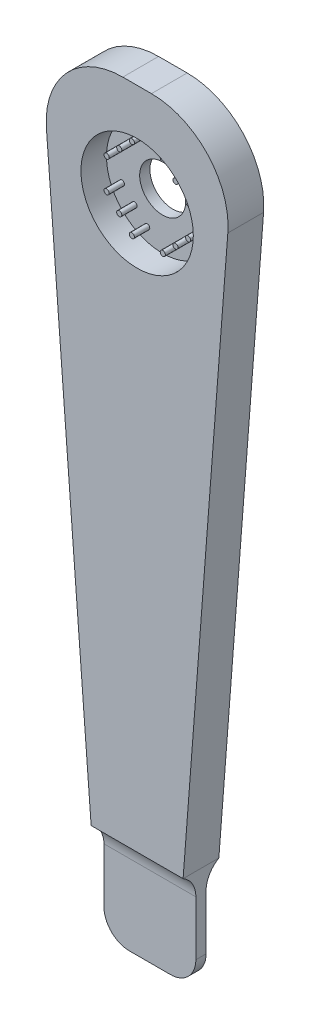
ISO-10303-21;
HEADER;
FILE_DESCRIPTION(('STEP AP214'),'2;1');
FILE_NAME('part.step','',(''),(''),'','','');
FILE_SCHEMA(('AUTOMOTIVE_DESIGN { 1 0 10303 214 1 1 1 1 }'));
ENDSEC;
DATA;
#1=APPLICATION_CONTEXT('core data for automotive mechanical design processes');
#2=APPLICATION_PROTOCOL_DEFINITION('international standard','automotive_design',2000,#1);
#3=PRODUCT_CONTEXT('',#1,'mechanical');
#4=PRODUCT('Part','Part','',(#3));
#5=PRODUCT_RELATED_PRODUCT_CATEGORY('part','',(#4));
#6=PRODUCT_DEFINITION_FORMATION('','',#4);
#7=PRODUCT_DEFINITION_CONTEXT('part definition',#1,'design');
#8=PRODUCT_DEFINITION('design','',#6,#7);
#9=PRODUCT_DEFINITION_SHAPE('','',#8);
#10=(LENGTH_UNIT() NAMED_UNIT(*) SI_UNIT(.MILLI.,.METRE.));
#11=(NAMED_UNIT(*) PLANE_ANGLE_UNIT() SI_UNIT($,.RADIAN.));
#12=(NAMED_UNIT(*) SI_UNIT($,.STERADIAN.) SOLID_ANGLE_UNIT());
#13=UNCERTAINTY_MEASURE_WITH_UNIT(LENGTH_MEASURE(1.E-05),#10,'distance_accuracy_value','');
#14=(GEOMETRIC_REPRESENTATION_CONTEXT(3) GLOBAL_UNCERTAINTY_ASSIGNED_CONTEXT((#13)) GLOBAL_UNIT_ASSIGNED_CONTEXT((#10,
#11,#12)) REPRESENTATION_CONTEXT('',''));
#15=CARTESIAN_POINT('',(0.,0.,0.));
#16=DIRECTION('',(0.,0.,1.));
#17=DIRECTION('',(1.,0.,0.));
#18=AXIS2_PLACEMENT_3D('',#15,#16,#17);
#19=CARTESIAN_POINT('',(9.,130.,7.));
#20=DIRECTION('',(0.,0.,-1.));
#21=DIRECTION('',(-1.,0.,0.));
#22=AXIS2_PLACEMENT_3D('',#19,#20,#21);
#23=CYLINDRICAL_SURFACE('',#22,4.50000000000001);
#24=CARTESIAN_POINT('',(9.,130.,0.));
#25=DIRECTION('',(0.,0.,1.));
#26=DIRECTION('',(1.,0.,0.));
#27=AXIS2_PLACEMENT_3D('',#24,#25,#26);
#28=CIRCLE('',#27,4.50000000000001);
#29=CARTESIAN_POINT('',(13.5,130.,0.));
#30=VERTEX_POINT('',#29);
#31=EDGE_CURVE('E228',#30,#30,#28,.T.);
#32=ORIENTED_EDGE('',*,*,#31,.F.);
#33=EDGE_LOOP('',(#32));
#34=FACE_BOUND('',#33,.T.);
#35=CARTESIAN_POINT('',(9.,130.,2.));
#36=DIRECTION('',(0.,0.,1.));
#37=DIRECTION('',(1.,0.,0.));
#38=AXIS2_PLACEMENT_3D('',#35,#36,#37);
#39=CIRCLE('',#38,4.50000000000001);
#40=CARTESIAN_POINT('',(13.5,130.,2.));
#41=VERTEX_POINT('',#40);
#42=EDGE_CURVE('E170',#41,#41,#39,.T.);
#43=ORIENTED_EDGE('',*,*,#42,.T.);
#44=EDGE_LOOP('',(#43));
#45=FACE_BOUND('',#44,.T.);
#46=ADVANCED_FACE('F43',(#34,#45),#23,.F.);
#47=CARTESIAN_POINT('',(16.3647058823529,-1.25882352941176,7.));
#48=DIRECTION('',(-0.997054485501582,0.076696498884737,0.));
#49=DIRECTION('',(-0.076696498884737,-0.997054485501582,0.));
#50=AXIS2_PLACEMENT_3D('',#47,#48,#49);
#51=PLANE('',#50);
#52=DIRECTION('',(0.076696498884737,0.997054485501582,0.));
#53=VECTOR('',#52,1.);
#54=CARTESIAN_POINT('',(16.3647058823529,-1.25882352941176,0.));
#55=LINE('',#54,#53);
#56=CARTESIAN_POINT('',(18.,20.,0.));
#57=VERTEX_POINT('',#56);
#58=CARTESIAN_POINT('',(26.7576578859022,133.849552516729,0.));
#59=VERTEX_POINT('',#58);
#60=EDGE_CURVE('E225',#57,#59,#55,.T.);
#61=ORIENTED_EDGE('',*,*,#60,.T.);
#62=DIRECTION('',(0.,0.,-1.));
#63=VECTOR('',#62,1.);
#64=CARTESIAN_POINT('',(26.7576578859022,133.849552516729,7.));
#65=LINE('',#64,#63);
#66=CARTESIAN_POINT('',(26.7576578859022,133.849552516729,7.));
#67=VERTEX_POINT('',#66);
#68=EDGE_CURVE('E66',#59,#67,#65,.F.);
#69=ORIENTED_EDGE('',*,*,#68,.T.);
#70=DIRECTION('',(0.076696498884737,0.997054485501582,0.));
#71=VECTOR('',#70,1.);
#72=CARTESIAN_POINT('',(16.3647058823529,-1.25882352941176,7.));
#73=LINE('',#72,#71);
#74=CARTESIAN_POINT('',(18.,20.,7.));
#75=VERTEX_POINT('',#74);
#76=EDGE_CURVE('E210',#75,#67,#73,.T.);
#77=ORIENTED_EDGE('',*,*,#76,.F.);
#78=DIRECTION('',(0.,0.,-1.));
#79=VECTOR('',#78,1.);
#80=CARTESIAN_POINT('',(18.,20.,7.));
#81=LINE('',#80,#79);
#82=EDGE_CURVE('E167',#75,#57,#81,.T.);
#83=ORIENTED_EDGE('',*,*,#82,.T.);
#84=EDGE_LOOP('',(#61,#69,#77,#83));
#85=FACE_BOUND('',#84,.T.);
#86=ADVANCED_FACE('F227',(#85),#51,.F.);
#87=CARTESIAN_POINT('',(0.,150.,7.));
#88=DIRECTION('',(0.,-1.,0.));
#89=DIRECTION('',(0.,0.,-1.));
#90=AXIS2_PLACEMENT_3D('',#87,#88,#89);
#91=PLANE('',#90);
#92=DIRECTION('',(-1.,0.,0.));
#93=VECTOR('',#92,1.);
#94=CARTESIAN_POINT('',(0.,150.,7.));
#95=LINE('',#94,#93);
#96=CARTESIAN_POINT('',(11.8018406033785,150.,7.));
#97=VERTEX_POINT('',#96);
#98=CARTESIAN_POINT('',(6.1981593966215,150.,7.));
#99=VERTEX_POINT('',#98);
#100=EDGE_CURVE('E208',#97,#99,#95,.T.);
#101=ORIENTED_EDGE('',*,*,#100,.F.);
#102=DIRECTION('',(0.,0.,-1.));
#103=VECTOR('',#102,1.);
#104=CARTESIAN_POINT('',(11.8018406033785,150.,7.));
#105=LINE('',#104,#103);
#106=CARTESIAN_POINT('',(11.8018406033785,150.,0.));
#107=VERTEX_POINT('',#106);
#108=EDGE_CURVE('E196',#97,#107,#105,.T.);
#109=ORIENTED_EDGE('',*,*,#108,.T.);
#110=DIRECTION('',(-1.,0.,0.));
#111=VECTOR('',#110,1.);
#112=CARTESIAN_POINT('',(0.,150.,0.));
#113=LINE('',#112,#111);
#114=CARTESIAN_POINT('',(6.1981593966215,150.,0.));
#115=VERTEX_POINT('',#114);
#116=EDGE_CURVE('E226',#107,#115,#113,.T.);
#117=ORIENTED_EDGE('',*,*,#116,.T.);
#118=DIRECTION('',(0.,0.,-1.));
#119=VECTOR('',#118,1.);
#120=CARTESIAN_POINT('',(6.1981593966215,150.,7.));
#121=LINE('',#120,#119);
#122=EDGE_CURVE('E194',#115,#99,#121,.F.);
#123=ORIENTED_EDGE('',*,*,#122,.T.);
#124=EDGE_LOOP('',(#101,#109,#117,#123));
#125=FACE_BOUND('',#124,.T.);
#126=ADVANCED_FACE('F214',(#125),#91,.F.);
#127=CARTESIAN_POINT('',(1.52941176470588,0.11764705882353,7.));
#128=DIRECTION('',(0.997054485501582,0.076696498884737,0.));
#129=DIRECTION('',(-0.076696498884737,0.997054485501582,0.));
#130=AXIS2_PLACEMENT_3D('',#127,#128,#129);
#131=PLANE('',#130);
#132=DIRECTION('',(0.0766964988847371,-0.997054485501582,0.));
#133=VECTOR('',#132,1.);
#134=CARTESIAN_POINT('',(1.52941176470588,0.11764705882353,7.));
#135=LINE('',#134,#133);
#136=CARTESIAN_POINT('',(-8.75765788590223,133.849552516729,7.));
#137=VERTEX_POINT('',#136);
#138=CARTESIAN_POINT('',(0.,20.,7.));
#139=VERTEX_POINT('',#138);
#140=EDGE_CURVE('E218',#137,#139,#135,.T.);
#141=ORIENTED_EDGE('',*,*,#140,.F.);
#142=DIRECTION('',(0.,0.,-1.));
#143=VECTOR('',#142,1.);
#144=CARTESIAN_POINT('',(-8.75765788590223,133.849552516729,7.));
#145=LINE('',#144,#143);
#146=CARTESIAN_POINT('',(-8.75765788590223,133.849552516729,0.));
#147=VERTEX_POINT('',#146);
#148=EDGE_CURVE('E11',#137,#147,#145,.T.);
#149=ORIENTED_EDGE('',*,*,#148,.T.);
#150=DIRECTION('',(0.0766964988847371,-0.997054485501582,0.));
#151=VECTOR('',#150,1.);
#152=CARTESIAN_POINT('',(1.52941176470588,0.11764705882353,0.));
#153=LINE('',#152,#151);
#154=CARTESIAN_POINT('',(0.,20.,0.));
#155=VERTEX_POINT('',#154);
#156=EDGE_CURVE('E230',#147,#155,#153,.T.);
#157=ORIENTED_EDGE('',*,*,#156,.T.);
#158=DIRECTION('',(0.,0.,-1.));
#159=VECTOR('',#158,1.);
#160=CARTESIAN_POINT('',(0.,20.,7.));
#161=LINE('',#160,#159);
#162=EDGE_CURVE('E163',#139,#155,#161,.T.);
#163=ORIENTED_EDGE('',*,*,#162,.F.);
#164=EDGE_LOOP('',(#141,#149,#157,#163));
#165=FACE_BOUND('',#164,.T.);
#166=ADVANCED_FACE('F374',(#165),#131,.F.);
#167=CARTESIAN_POINT('',(0.,0.,7.));
#168=DIRECTION('',(1.,0.,0.));
#169=DIRECTION('',(0.,1.,0.));
#170=AXIS2_PLACEMENT_3D('',#167,#168,#169);
#171=PLANE('',#170);
#172=DIRECTION('',(0.,1.,0.));
#173=VECTOR('',#172,1.);
#174=CARTESIAN_POINT('',(0.,0.,2.5));
#175=LINE('',#174,#173);
#176=CARTESIAN_POINT('',(0.,5.,2.5));
#177=VERTEX_POINT('',#176);
#178=CARTESIAN_POINT('',(0.,15.6698729810778,2.5));
#179=VERTEX_POINT('',#178);
#180=EDGE_CURVE('E157',#177,#179,#175,.T.);
#181=ORIENTED_EDGE('',*,*,#180,.F.);
#182=DIRECTION('',(0.,0.,-1.));
#183=VECTOR('',#182,1.);
#184=CARTESIAN_POINT('',(0.,5.,4.5));
#185=LINE('',#184,#183);
#186=CARTESIAN_POINT('',(0.,5.,4.5));
#187=VERTEX_POINT('',#186);
#188=EDGE_CURVE('E174',#177,#187,#185,.F.);
#189=ORIENTED_EDGE('',*,*,#188,.T.);
#190=DIRECTION('',(0.,-1.,0.));
#191=VECTOR('',#190,1.);
#192=CARTESIAN_POINT('',(0.,0.,4.5));
#193=LINE('',#192,#191);
#194=CARTESIAN_POINT('',(0.,15.6698729810778,4.5));
#195=VERTEX_POINT('',#194);
#196=EDGE_CURVE('E322',#195,#187,#193,.T.);
#197=ORIENTED_EDGE('',*,*,#196,.F.);
#198=CARTESIAN_POINT('',(0.,15.6698729810778,9.5));
#199=DIRECTION('',(1.,0.,0.));
#200=DIRECTION('',(0.,1.,0.));
#201=AXIS2_PLACEMENT_3D('',#198,#199,#200);
#202=CIRCLE('',#201,5.);
#203=EDGE_CURVE('E184',#195,#139,#202,.T.);
#204=ORIENTED_EDGE('',*,*,#203,.T.);
#205=ORIENTED_EDGE('',*,*,#162,.T.);
#206=CARTESIAN_POINT('',(0.,15.6698729810778,-2.5));
#207=DIRECTION('',(1.,0.,0.));
#208=DIRECTION('',(0.,1.,0.));
#209=AXIS2_PLACEMENT_3D('',#206,#207,#208);
#210=CIRCLE('',#209,5.);
#211=EDGE_CURVE('E192',#155,#179,#210,.T.);
#212=ORIENTED_EDGE('',*,*,#211,.T.);
#213=EDGE_LOOP('',(#181,#189,#197,#204,#205,#212));
#214=FACE_BOUND('',#213,.T.);
#215=ADVANCED_FACE('F350',(#214),#171,.F.);
#216=CARTESIAN_POINT('',(0.,0.,7.));
#217=DIRECTION('',(0.,-1.,0.));
#218=DIRECTION('',(1.,0.,0.));
#219=AXIS2_PLACEMENT_3D('',#216,#217,#218);
#220=PLANE('',#219);
#221=DIRECTION('',(1.,0.,0.));
#222=VECTOR('',#221,1.);
#223=CARTESIAN_POINT('',(0.,0.,4.5));
#224=LINE('',#223,#222);
#225=CARTESIAN_POINT('',(5.,0.,4.5));
#226=VERTEX_POINT('',#225);
#227=CARTESIAN_POINT('',(13.,0.,4.5));
#228=VERTEX_POINT('',#227);
#229=EDGE_CURVE('E325',#226,#228,#224,.T.);
#230=ORIENTED_EDGE('',*,*,#229,.F.);
#231=DIRECTION('',(0.,0.,-1.));
#232=VECTOR('',#231,1.);
#233=CARTESIAN_POINT('',(5.,0.,2.5));
#234=LINE('',#233,#232);
#235=CARTESIAN_POINT('',(5.,0.,2.5));
#236=VERTEX_POINT('',#235);
#237=EDGE_CURVE('E156',#226,#236,#234,.T.);
#238=ORIENTED_EDGE('',*,*,#237,.T.);
#239=DIRECTION('',(-1.,0.,0.));
#240=VECTOR('',#239,1.);
#241=CARTESIAN_POINT('',(0.,0.,2.5));
#242=LINE('',#241,#240);
#243=CARTESIAN_POINT('',(13.,0.,2.5));
#244=VERTEX_POINT('',#243);
#245=EDGE_CURVE('E138',#244,#236,#242,.T.);
#246=ORIENTED_EDGE('',*,*,#245,.F.);
#247=DIRECTION('',(0.,0.,-1.));
#248=VECTOR('',#247,1.);
#249=CARTESIAN_POINT('',(13.,0.,4.5));
#250=LINE('',#249,#248);
#251=EDGE_CURVE('E153',#244,#228,#250,.F.);
#252=ORIENTED_EDGE('',*,*,#251,.T.);
#253=EDGE_LOOP('',(#230,#238,#246,#252));
#254=FACE_BOUND('',#253,.T.);
#255=ADVANCED_FACE('F152',(#254),#220,.T.);
#256=CARTESIAN_POINT('',(18.,0.,7.));
#257=DIRECTION('',(-1.,0.,0.));
#258=DIRECTION('',(0.,0.,1.));
#259=AXIS2_PLACEMENT_3D('',#256,#257,#258);
#260=PLANE('',#259);
#261=DIRECTION('',(0.,1.,0.));
#262=VECTOR('',#261,1.);
#263=CARTESIAN_POINT('',(18.,0.,4.5));
#264=LINE('',#263,#262);
#265=CARTESIAN_POINT('',(18.,5.,4.5));
#266=VERTEX_POINT('',#265);
#267=CARTESIAN_POINT('',(18.,15.6698729810778,4.5));
#268=VERTEX_POINT('',#267);
#269=EDGE_CURVE('E316',#266,#268,#264,.T.);
#270=ORIENTED_EDGE('',*,*,#269,.F.);
#271=DIRECTION('',(0.,0.,-1.));
#272=VECTOR('',#271,1.);
#273=CARTESIAN_POINT('',(18.,5.,2.5));
#274=LINE('',#273,#272);
#275=CARTESIAN_POINT('',(18.,5.,2.5));
#276=VERTEX_POINT('',#275);
#277=EDGE_CURVE('E182',#266,#276,#274,.T.);
#278=ORIENTED_EDGE('',*,*,#277,.T.);
#279=DIRECTION('',(0.,-1.,0.));
#280=VECTOR('',#279,1.);
#281=CARTESIAN_POINT('',(18.,0.,2.5));
#282=LINE('',#281,#280);
#283=CARTESIAN_POINT('',(18.,15.6698729810778,2.5));
#284=VERTEX_POINT('',#283);
#285=EDGE_CURVE('E141',#284,#276,#282,.T.);
#286=ORIENTED_EDGE('',*,*,#285,.F.);
#287=CARTESIAN_POINT('',(18.,15.6698729810778,-2.5));
#288=DIRECTION('',(-1.,0.,0.));
#289=DIRECTION('',(0.,0.,1.));
#290=AXIS2_PLACEMENT_3D('',#287,#288,#289);
#291=CIRCLE('',#290,5.);
#292=EDGE_CURVE('E189',#284,#57,#291,.T.);
#293=ORIENTED_EDGE('',*,*,#292,.T.);
#294=ORIENTED_EDGE('',*,*,#82,.F.);
#295=CARTESIAN_POINT('',(18.,15.6698729810778,9.5));
#296=DIRECTION('',(-1.,0.,0.));
#297=DIRECTION('',(0.,0.,1.));
#298=AXIS2_PLACEMENT_3D('',#295,#296,#297);
#299=CIRCLE('',#298,5.);
#300=EDGE_CURVE('E187',#75,#268,#299,.T.);
#301=ORIENTED_EDGE('',*,*,#300,.T.);
#302=EDGE_LOOP('',(#270,#278,#286,#293,#294,#301));
#303=FACE_BOUND('',#302,.T.);
#304=ADVANCED_FACE('F342',(#303),#260,.F.);
#305=CARTESIAN_POINT('',(0.,0.,7.));
#306=DIRECTION('',(0.,0.,1.));
#307=DIRECTION('',(1.,0.,0.));
#308=AXIS2_PLACEMENT_3D('',#305,#306,#307);
#309=PLANE('',#308);
#310=ORIENTED_EDGE('',*,*,#76,.T.);
#311=CARTESIAN_POINT('',(11.8018406033785,135.,7.));
#312=DIRECTION('',(0.,0.,1.));
#313=DIRECTION('',(1.,0.,0.));
#314=AXIS2_PLACEMENT_3D('',#311,#312,#313);
#315=CIRCLE('',#314,15.);
#316=EDGE_CURVE('E51',#67,#97,#315,.T.);
#317=ORIENTED_EDGE('',*,*,#316,.T.);
#318=ORIENTED_EDGE('',*,*,#100,.T.);
#319=CARTESIAN_POINT('',(6.1981593966215,135.,7.));
#320=DIRECTION('',(0.,0.,1.));
#321=DIRECTION('',(1.,0.,0.));
#322=AXIS2_PLACEMENT_3D('',#319,#320,#321);
#323=CIRCLE('',#322,15.);
#324=EDGE_CURVE('E58',#99,#137,#323,.T.);
#325=ORIENTED_EDGE('',*,*,#324,.T.);
#326=ORIENTED_EDGE('',*,*,#140,.T.);
#327=DIRECTION('',(-1.,0.,0.));
#328=VECTOR('',#327,1.);
#329=CARTESIAN_POINT('',(0.,20.,7.));
#330=LINE('',#329,#328);
#331=EDGE_CURVE('E319',#75,#139,#330,.T.);
#332=ORIENTED_EDGE('',*,*,#331,.F.);
#333=EDGE_LOOP('',(#310,#317,#318,#325,#326,#332));
#334=FACE_BOUND('',#333,.T.);
#335=CARTESIAN_POINT('',(9.,130.,7.));
#336=DIRECTION('',(0.,0.,1.));
#337=DIRECTION('',(1.,0.,0.));
#338=AXIS2_PLACEMENT_3D('',#335,#336,#337);
#339=CIRCLE('',#338,11.);
#340=CARTESIAN_POINT('',(20.,130.,7.));
#341=VERTEX_POINT('',#340);
#342=EDGE_CURVE('E240',#341,#341,#339,.T.);
#343=ORIENTED_EDGE('',*,*,#342,.F.);
#344=EDGE_LOOP('',(#343));
#345=FACE_BOUND('',#344,.T.);
#346=ADVANCED_FACE('F206',(#334,#345),#309,.T.);
#347=CARTESIAN_POINT('',(0.,0.,0.));
#348=DIRECTION('',(0.,0.,1.));
#349=DIRECTION('',(1.,0.,0.));
#350=AXIS2_PLACEMENT_3D('',#347,#348,#349);
#351=PLANE('',#350);
#352=ORIENTED_EDGE('',*,*,#31,.T.);
#353=EDGE_LOOP('',(#352));
#354=FACE_BOUND('',#353,.T.);
#355=ORIENTED_EDGE('',*,*,#116,.F.);
#356=CARTESIAN_POINT('',(11.8018406033785,135.,0.));
#357=DIRECTION('',(0.,0.,1.));
#358=DIRECTION('',(1.,0.,0.));
#359=AXIS2_PLACEMENT_3D('',#356,#357,#358);
#360=CIRCLE('',#359,15.);
#361=EDGE_CURVE('E201',#107,#59,#360,.F.);
#362=ORIENTED_EDGE('',*,*,#361,.T.);
#363=ORIENTED_EDGE('',*,*,#60,.F.);
#364=DIRECTION('',(1.,0.,0.));
#365=VECTOR('',#364,1.);
#366=CARTESIAN_POINT('',(0.,20.,0.));
#367=LINE('',#366,#365);
#368=EDGE_CURVE('E158',#155,#57,#367,.T.);
#369=ORIENTED_EDGE('',*,*,#368,.F.);
#370=ORIENTED_EDGE('',*,*,#156,.F.);
#371=CARTESIAN_POINT('',(6.1981593966215,135.,0.));
#372=DIRECTION('',(0.,0.,1.));
#373=DIRECTION('',(1.,0.,0.));
#374=AXIS2_PLACEMENT_3D('',#371,#372,#373);
#375=CIRCLE('',#374,15.);
#376=EDGE_CURVE('E199',#147,#115,#375,.F.);
#377=ORIENTED_EDGE('',*,*,#376,.T.);
#378=EDGE_LOOP('',(#355,#362,#363,#369,#370,#377));
#379=FACE_BOUND('',#378,.T.);
#380=ADVANCED_FACE('F223',(#354,#379),#351,.F.);
#381=CARTESIAN_POINT('',(9.,130.,2.));
#382=DIRECTION('',(0.,0.,1.));
#383=DIRECTION('',(1.,0.,0.));
#384=AXIS2_PLACEMENT_3D('',#381,#382,#383);
#385=CYLINDRICAL_SURFACE('',#384,11.);
#386=CARTESIAN_POINT('',(9.,130.,2.));
#387=DIRECTION('',(0.,0.,1.));
#388=DIRECTION('',(1.,0.,0.));
#389=AXIS2_PLACEMENT_3D('',#386,#387,#388);
#390=CIRCLE('',#389,11.);
#391=CARTESIAN_POINT('',(20.,130.,2.));
#392=VERTEX_POINT('',#391);
#393=EDGE_CURVE('E243',#392,#392,#390,.T.);
#394=ORIENTED_EDGE('',*,*,#393,.F.);
#395=EDGE_LOOP('',(#394));
#396=FACE_BOUND('',#395,.T.);
#397=ORIENTED_EDGE('',*,*,#342,.T.);
#398=EDGE_LOOP('',(#397));
#399=FACE_BOUND('',#398,.T.);
#400=ADVANCED_FACE('F386',(#396,#399),#385,.F.);
#401=CARTESIAN_POINT('',(9.,130.,2.));
#402=DIRECTION('',(0.,0.,1.));
#403=DIRECTION('',(1.,0.,0.));
#404=AXIS2_PLACEMENT_3D('',#401,#402,#403);
#405=PLANE('',#404);
#406=CARTESIAN_POINT('',(12.0251262658471,137.974873734153,2.));
#407=DIRECTION('',(0.,0.,1.));
#408=DIRECTION('',(1.,0.,0.));
#409=AXIS2_PLACEMENT_3D('',#406,#407,#408);
#410=CIRCLE('',#409,0.500000000000001);
#411=CARTESIAN_POINT('',(12.5251262658471,137.974873734153,2.));
#412=VERTEX_POINT('',#411);
#413=EDGE_CURVE('E310',#412,#412,#410,.T.);
#414=ORIENTED_EDGE('',*,*,#413,.F.);
#415=EDGE_LOOP('',(#414));
#416=FACE_BOUND('',#415,.T.);
#417=CARTESIAN_POINT('',(14.5,135.5,2.));
#418=DIRECTION('',(0.,0.,1.));
#419=DIRECTION('',(1.,0.,0.));
#420=AXIS2_PLACEMENT_3D('',#417,#418,#419);
#421=CIRCLE('',#420,0.500000000000001);
#422=CARTESIAN_POINT('',(15.,135.5,2.));
#423=VERTEX_POINT('',#422);
#424=EDGE_CURVE('E304',#423,#423,#421,.T.);
#425=ORIENTED_EDGE('',*,*,#424,.F.);
#426=EDGE_LOOP('',(#425));
#427=FACE_BOUND('',#426,.T.);
#428=CARTESIAN_POINT('',(16.9748737341529,133.025126265847,2.));
#429=DIRECTION('',(0.,0.,1.));
#430=DIRECTION('',(1.,0.,0.));
#431=AXIS2_PLACEMENT_3D('',#428,#429,#430);
#432=CIRCLE('',#431,0.499999999999999);
#433=CARTESIAN_POINT('',(17.4748737341529,133.025126265847,2.));
#434=VERTEX_POINT('',#433);
#435=EDGE_CURVE('E298',#434,#434,#432,.T.);
#436=ORIENTED_EDGE('',*,*,#435,.F.);
#437=EDGE_LOOP('',(#436));
#438=FACE_BOUND('',#437,.T.);
#439=CARTESIAN_POINT('',(16.9748737341529,126.974873734153,2.));
#440=DIRECTION('',(0.,0.,1.));
#441=DIRECTION('',(1.,0.,0.));
#442=AXIS2_PLACEMENT_3D('',#439,#440,#441);
#443=CIRCLE('',#442,0.499999999999999);
#444=CARTESIAN_POINT('',(17.4748737341529,126.974873734153,2.));
#445=VERTEX_POINT('',#444);
#446=EDGE_CURVE('E292',#445,#445,#443,.T.);
#447=ORIENTED_EDGE('',*,*,#446,.F.);
#448=EDGE_LOOP('',(#447));
#449=FACE_BOUND('',#448,.T.);
#450=CARTESIAN_POINT('',(14.5,124.5,2.));
#451=DIRECTION('',(0.,0.,1.));
#452=DIRECTION('',(1.,0.,0.));
#453=AXIS2_PLACEMENT_3D('',#450,#451,#452);
#454=CIRCLE('',#453,0.500000000000001);
#455=CARTESIAN_POINT('',(15.,124.5,2.));
#456=VERTEX_POINT('',#455);
#457=EDGE_CURVE('E286',#456,#456,#454,.T.);
#458=ORIENTED_EDGE('',*,*,#457,.F.);
#459=EDGE_LOOP('',(#458));
#460=FACE_BOUND('',#459,.T.);
#461=CARTESIAN_POINT('',(12.0251262658471,122.025126265847,2.));
#462=DIRECTION('',(0.,0.,1.));
#463=DIRECTION('',(1.,0.,0.));
#464=AXIS2_PLACEMENT_3D('',#461,#462,#463);
#465=CIRCLE('',#464,0.500000000000001);
#466=CARTESIAN_POINT('',(12.5251262658471,122.025126265847,2.));
#467=VERTEX_POINT('',#466);
#468=EDGE_CURVE('E280',#467,#467,#465,.T.);
#469=ORIENTED_EDGE('',*,*,#468,.F.);
#470=EDGE_LOOP('',(#469));
#471=FACE_BOUND('',#470,.T.);
#472=CARTESIAN_POINT('',(5.9748737341529,122.025126265847,2.));
#473=DIRECTION('',(0.,0.,1.));
#474=DIRECTION('',(1.,0.,0.));
#475=AXIS2_PLACEMENT_3D('',#472,#473,#474);
#476=CIRCLE('',#475,0.500000000000001);
#477=CARTESIAN_POINT('',(6.4748737341529,122.025126265847,2.));
#478=VERTEX_POINT('',#477);
#479=EDGE_CURVE('E274',#478,#478,#476,.T.);
#480=ORIENTED_EDGE('',*,*,#479,.F.);
#481=EDGE_LOOP('',(#480));
#482=FACE_BOUND('',#481,.T.);
#483=CARTESIAN_POINT('',(3.5,124.5,2.));
#484=DIRECTION('',(0.,0.,1.));
#485=DIRECTION('',(1.,0.,0.));
#486=AXIS2_PLACEMENT_3D('',#483,#484,#485);
#487=CIRCLE('',#486,0.5);
#488=CARTESIAN_POINT('',(4.,124.5,2.));
#489=VERTEX_POINT('',#488);
#490=EDGE_CURVE('E268',#489,#489,#487,.T.);
#491=ORIENTED_EDGE('',*,*,#490,.F.);
#492=EDGE_LOOP('',(#491));
#493=FACE_BOUND('',#492,.T.);
#494=CARTESIAN_POINT('',(1.02512626584708,126.974873734153,2.));
#495=DIRECTION('',(0.,0.,1.));
#496=DIRECTION('',(1.,0.,0.));
#497=AXIS2_PLACEMENT_3D('',#494,#495,#496);
#498=CIRCLE('',#497,0.5);
#499=CARTESIAN_POINT('',(1.52512626584708,126.974873734153,2.));
#500=VERTEX_POINT('',#499);
#501=EDGE_CURVE('E262',#500,#500,#498,.T.);
#502=ORIENTED_EDGE('',*,*,#501,.F.);
#503=EDGE_LOOP('',(#502));
#504=FACE_BOUND('',#503,.T.);
#505=CARTESIAN_POINT('',(1.02512626584707,133.025126265847,2.));
#506=DIRECTION('',(0.,0.,1.));
#507=DIRECTION('',(1.,0.,0.));
#508=AXIS2_PLACEMENT_3D('',#505,#506,#507);
#509=CIRCLE('',#508,0.5);
#510=CARTESIAN_POINT('',(1.52512626584707,133.025126265847,2.));
#511=VERTEX_POINT('',#510);
#512=EDGE_CURVE('E256',#511,#511,#509,.T.);
#513=ORIENTED_EDGE('',*,*,#512,.F.);
#514=EDGE_LOOP('',(#513));
#515=FACE_BOUND('',#514,.T.);
#516=CARTESIAN_POINT('',(5.9748737341529,137.974873734153,2.));
#517=DIRECTION('',(0.,0.,1.));
#518=DIRECTION('',(1.,0.,0.));
#519=AXIS2_PLACEMENT_3D('',#516,#517,#518);
#520=CIRCLE('',#519,0.500000000000001);
#521=CARTESIAN_POINT('',(6.4748737341529,137.974873734153,2.));
#522=VERTEX_POINT('',#521);
#523=EDGE_CURVE('E250',#522,#522,#520,.T.);
#524=ORIENTED_EDGE('',*,*,#523,.F.);
#525=EDGE_LOOP('',(#524));
#526=FACE_BOUND('',#525,.T.);
#527=CARTESIAN_POINT('',(3.49999999999998,135.5,2.));
#528=DIRECTION('',(0.,0.,1.));
#529=DIRECTION('',(1.,0.,0.));
#530=AXIS2_PLACEMENT_3D('',#527,#528,#529);
#531=CIRCLE('',#530,0.5);
#532=CARTESIAN_POINT('',(3.99999999999998,135.5,2.));
#533=VERTEX_POINT('',#532);
#534=EDGE_CURVE('E247',#533,#533,#531,.T.);
#535=ORIENTED_EDGE('',*,*,#534,.F.);
#536=EDGE_LOOP('',(#535));
#537=FACE_BOUND('',#536,.T.);
#538=ORIENTED_EDGE('',*,*,#42,.F.);
#539=EDGE_LOOP('',(#538));
#540=FACE_BOUND('',#539,.T.);
#541=ORIENTED_EDGE('',*,*,#393,.T.);
#542=EDGE_LOOP('',(#541));
#543=FACE_BOUND('',#542,.T.);
#544=ADVANCED_FACE('F392',(#416,#427,#438,#449,#460,#471,#482,#493,#504,#515,#526,#537,#540,
#543),#405,.T.);
#545=CARTESIAN_POINT('',(3.49999999999998,135.5,5.));
#546=DIRECTION('',(0.,0.,-1.));
#547=DIRECTION('',(-1.,0.,0.));
#548=AXIS2_PLACEMENT_3D('',#545,#546,#547);
#549=CYLINDRICAL_SURFACE('',#548,0.5);
#550=CARTESIAN_POINT('',(3.49999999999998,135.5,5.));
#551=DIRECTION('',(0.,0.,1.));
#552=DIRECTION('',(1.,0.,0.));
#553=AXIS2_PLACEMENT_3D('',#550,#551,#552);
#554=CIRCLE('',#553,0.5);
#555=CARTESIAN_POINT('',(3.99999999999998,135.5,5.));
#556=VERTEX_POINT('',#555);
#557=EDGE_CURVE('E244',#556,#556,#554,.T.);
#558=ORIENTED_EDGE('',*,*,#557,.F.);
#559=EDGE_LOOP('',(#558));
#560=FACE_BOUND('',#559,.T.);
#561=ORIENTED_EDGE('',*,*,#534,.T.);
#562=EDGE_LOOP('',(#561));
#563=FACE_BOUND('',#562,.T.);
#564=ADVANCED_FACE('F396',(#560,#563),#549,.T.);
#565=CARTESIAN_POINT('',(3.49999999999998,135.5,5.));
#566=DIRECTION('',(0.,0.,1.));
#567=DIRECTION('',(1.,0.,0.));
#568=AXIS2_PLACEMENT_3D('',#565,#566,#567);
#569=PLANE('',#568);
#570=ORIENTED_EDGE('',*,*,#557,.T.);
#571=EDGE_LOOP('',(#570));
#572=FACE_BOUND('',#571,.T.);
#573=ADVANCED_FACE('F400',(#572),#569,.T.);
#574=CARTESIAN_POINT('',(5.9748737341529,137.974873734153,5.));
#575=DIRECTION('',(0.,0.,-1.));
#576=DIRECTION('',(-1.,0.,0.));
#577=AXIS2_PLACEMENT_3D('',#574,#575,#576);
#578=CYLINDRICAL_SURFACE('',#577,0.500000000000001);
#579=CARTESIAN_POINT('',(5.9748737341529,137.974873734153,5.));
#580=DIRECTION('',(0.,0.,1.));
#581=DIRECTION('',(1.,0.,0.));
#582=AXIS2_PLACEMENT_3D('',#579,#580,#581);
#583=CIRCLE('',#582,0.500000000000001);
#584=CARTESIAN_POINT('',(6.4748737341529,137.974873734153,5.));
#585=VERTEX_POINT('',#584);
#586=EDGE_CURVE('E253',#585,#585,#583,.T.);
#587=ORIENTED_EDGE('',*,*,#586,.F.);
#588=EDGE_LOOP('',(#587));
#589=FACE_BOUND('',#588,.T.);
#590=ORIENTED_EDGE('',*,*,#523,.T.);
#591=EDGE_LOOP('',(#590));
#592=FACE_BOUND('',#591,.T.);
#593=ADVANCED_FACE('F404',(#589,#592),#578,.T.);
#594=CARTESIAN_POINT('',(5.9748737341529,137.974873734153,5.));
#595=DIRECTION('',(0.,0.,1.));
#596=DIRECTION('',(1.,0.,0.));
#597=AXIS2_PLACEMENT_3D('',#594,#595,#596);
#598=PLANE('',#597);
#599=ORIENTED_EDGE('',*,*,#586,.T.);
#600=EDGE_LOOP('',(#599));
#601=FACE_BOUND('',#600,.T.);
#602=ADVANCED_FACE('F406',(#601),#598,.T.);
#603=CARTESIAN_POINT('',(1.02512626584707,133.025126265847,5.));
#604=DIRECTION('',(0.,0.,-1.));
#605=DIRECTION('',(-1.,0.,0.));
#606=AXIS2_PLACEMENT_3D('',#603,#604,#605);
#607=CYLINDRICAL_SURFACE('',#606,0.5);
#608=CARTESIAN_POINT('',(1.02512626584707,133.025126265847,5.));
#609=DIRECTION('',(0.,0.,1.));
#610=DIRECTION('',(1.,0.,0.));
#611=AXIS2_PLACEMENT_3D('',#608,#609,#610);
#612=CIRCLE('',#611,0.5);
#613=CARTESIAN_POINT('',(1.52512626584707,133.025126265847,5.));
#614=VERTEX_POINT('',#613);
#615=EDGE_CURVE('E259',#614,#614,#612,.T.);
#616=ORIENTED_EDGE('',*,*,#615,.F.);
#617=EDGE_LOOP('',(#616));
#618=FACE_BOUND('',#617,.T.);
#619=ORIENTED_EDGE('',*,*,#512,.T.);
#620=EDGE_LOOP('',(#619));
#621=FACE_BOUND('',#620,.T.);
#622=ADVANCED_FACE('F409',(#618,#621),#607,.T.);
#623=CARTESIAN_POINT('',(1.02512626584707,133.025126265847,5.));
#624=DIRECTION('',(0.,0.,1.));
#625=DIRECTION('',(1.,0.,0.));
#626=AXIS2_PLACEMENT_3D('',#623,#624,#625);
#627=PLANE('',#626);
#628=ORIENTED_EDGE('',*,*,#615,.T.);
#629=EDGE_LOOP('',(#628));
#630=FACE_BOUND('',#629,.T.);
#631=ADVANCED_FACE('F414',(#630),#627,.T.);
#632=CARTESIAN_POINT('',(1.02512626584708,126.974873734153,5.));
#633=DIRECTION('',(0.,0.,-1.));
#634=DIRECTION('',(-1.,0.,0.));
#635=AXIS2_PLACEMENT_3D('',#632,#633,#634);
#636=CYLINDRICAL_SURFACE('',#635,0.5);
#637=CARTESIAN_POINT('',(1.02512626584708,126.974873734153,5.));
#638=DIRECTION('',(0.,0.,1.));
#639=DIRECTION('',(1.,0.,0.));
#640=AXIS2_PLACEMENT_3D('',#637,#638,#639);
#641=CIRCLE('',#640,0.5);
#642=CARTESIAN_POINT('',(1.52512626584708,126.974873734153,5.));
#643=VERTEX_POINT('',#642);
#644=EDGE_CURVE('E265',#643,#643,#641,.T.);
#645=ORIENTED_EDGE('',*,*,#644,.F.);
#646=EDGE_LOOP('',(#645));
#647=FACE_BOUND('',#646,.T.);
#648=ORIENTED_EDGE('',*,*,#501,.T.);
#649=EDGE_LOOP('',(#648));
#650=FACE_BOUND('',#649,.T.);
#651=ADVANCED_FACE('F417',(#647,#650),#636,.T.);
#652=CARTESIAN_POINT('',(1.02512626584708,126.974873734153,5.));
#653=DIRECTION('',(0.,0.,1.));
#654=DIRECTION('',(1.,0.,0.));
#655=AXIS2_PLACEMENT_3D('',#652,#653,#654);
#656=PLANE('',#655);
#657=ORIENTED_EDGE('',*,*,#644,.T.);
#658=EDGE_LOOP('',(#657));
#659=FACE_BOUND('',#658,.T.);
#660=ADVANCED_FACE('F422',(#659),#656,.T.);
#661=CARTESIAN_POINT('',(3.5,124.5,5.));
#662=DIRECTION('',(0.,0.,-1.));
#663=DIRECTION('',(-1.,0.,0.));
#664=AXIS2_PLACEMENT_3D('',#661,#662,#663);
#665=CYLINDRICAL_SURFACE('',#664,0.5);
#666=CARTESIAN_POINT('',(3.5,124.5,5.));
#667=DIRECTION('',(0.,0.,1.));
#668=DIRECTION('',(1.,0.,0.));
#669=AXIS2_PLACEMENT_3D('',#666,#667,#668);
#670=CIRCLE('',#669,0.5);
#671=CARTESIAN_POINT('',(4.,124.5,5.));
#672=VERTEX_POINT('',#671);
#673=EDGE_CURVE('E271',#672,#672,#670,.T.);
#674=ORIENTED_EDGE('',*,*,#673,.F.);
#675=EDGE_LOOP('',(#674));
#676=FACE_BOUND('',#675,.T.);
#677=ORIENTED_EDGE('',*,*,#490,.T.);
#678=EDGE_LOOP('',(#677));
#679=FACE_BOUND('',#678,.T.);
#680=ADVANCED_FACE('F425',(#676,#679),#665,.T.);
#681=CARTESIAN_POINT('',(3.5,124.5,5.));
#682=DIRECTION('',(0.,0.,1.));
#683=DIRECTION('',(1.,0.,0.));
#684=AXIS2_PLACEMENT_3D('',#681,#682,#683);
#685=PLANE('',#684);
#686=ORIENTED_EDGE('',*,*,#673,.T.);
#687=EDGE_LOOP('',(#686));
#688=FACE_BOUND('',#687,.T.);
#689=ADVANCED_FACE('F430',(#688),#685,.T.);
#690=CARTESIAN_POINT('',(5.9748737341529,122.025126265847,5.));
#691=DIRECTION('',(0.,0.,-1.));
#692=DIRECTION('',(-1.,0.,0.));
#693=AXIS2_PLACEMENT_3D('',#690,#691,#692);
#694=CYLINDRICAL_SURFACE('',#693,0.500000000000001);
#695=CARTESIAN_POINT('',(5.9748737341529,122.025126265847,5.));
#696=DIRECTION('',(0.,0.,1.));
#697=DIRECTION('',(1.,0.,0.));
#698=AXIS2_PLACEMENT_3D('',#695,#696,#697);
#699=CIRCLE('',#698,0.500000000000001);
#700=CARTESIAN_POINT('',(6.4748737341529,122.025126265847,5.));
#701=VERTEX_POINT('',#700);
#702=EDGE_CURVE('E277',#701,#701,#699,.T.);
#703=ORIENTED_EDGE('',*,*,#702,.F.);
#704=EDGE_LOOP('',(#703));
#705=FACE_BOUND('',#704,.T.);
#706=ORIENTED_EDGE('',*,*,#479,.T.);
#707=EDGE_LOOP('',(#706));
#708=FACE_BOUND('',#707,.T.);
#709=ADVANCED_FACE('F433',(#705,#708),#694,.T.);
#710=CARTESIAN_POINT('',(5.9748737341529,122.025126265847,5.));
#711=DIRECTION('',(0.,0.,1.));
#712=DIRECTION('',(1.,0.,0.));
#713=AXIS2_PLACEMENT_3D('',#710,#711,#712);
#714=PLANE('',#713);
#715=ORIENTED_EDGE('',*,*,#702,.T.);
#716=EDGE_LOOP('',(#715));
#717=FACE_BOUND('',#716,.T.);
#718=ADVANCED_FACE('F438',(#717),#714,.T.);
#719=CARTESIAN_POINT('',(12.0251262658471,122.025126265847,5.));
#720=DIRECTION('',(0.,0.,-1.));
#721=DIRECTION('',(-1.,0.,0.));
#722=AXIS2_PLACEMENT_3D('',#719,#720,#721);
#723=CYLINDRICAL_SURFACE('',#722,0.500000000000001);
#724=CARTESIAN_POINT('',(12.0251262658471,122.025126265847,5.));
#725=DIRECTION('',(0.,0.,1.));
#726=DIRECTION('',(1.,0.,0.));
#727=AXIS2_PLACEMENT_3D('',#724,#725,#726);
#728=CIRCLE('',#727,0.500000000000001);
#729=CARTESIAN_POINT('',(12.5251262658471,122.025126265847,5.));
#730=VERTEX_POINT('',#729);
#731=EDGE_CURVE('E283',#730,#730,#728,.T.);
#732=ORIENTED_EDGE('',*,*,#731,.F.);
#733=EDGE_LOOP('',(#732));
#734=FACE_BOUND('',#733,.T.);
#735=ORIENTED_EDGE('',*,*,#468,.T.);
#736=EDGE_LOOP('',(#735));
#737=FACE_BOUND('',#736,.T.);
#738=ADVANCED_FACE('F441',(#734,#737),#723,.T.);
#739=CARTESIAN_POINT('',(12.0251262658471,122.025126265847,5.));
#740=DIRECTION('',(0.,0.,1.));
#741=DIRECTION('',(1.,0.,0.));
#742=AXIS2_PLACEMENT_3D('',#739,#740,#741);
#743=PLANE('',#742);
#744=ORIENTED_EDGE('',*,*,#731,.T.);
#745=EDGE_LOOP('',(#744));
#746=FACE_BOUND('',#745,.T.);
#747=ADVANCED_FACE('F446',(#746),#743,.T.);
#748=CARTESIAN_POINT('',(14.5,124.5,5.));
#749=DIRECTION('',(0.,0.,-1.));
#750=DIRECTION('',(-1.,0.,0.));
#751=AXIS2_PLACEMENT_3D('',#748,#749,#750);
#752=CYLINDRICAL_SURFACE('',#751,0.500000000000001);
#753=CARTESIAN_POINT('',(14.5,124.5,5.));
#754=DIRECTION('',(0.,0.,1.));
#755=DIRECTION('',(1.,0.,0.));
#756=AXIS2_PLACEMENT_3D('',#753,#754,#755);
#757=CIRCLE('',#756,0.500000000000001);
#758=CARTESIAN_POINT('',(15.,124.5,5.));
#759=VERTEX_POINT('',#758);
#760=EDGE_CURVE('E289',#759,#759,#757,.T.);
#761=ORIENTED_EDGE('',*,*,#760,.F.);
#762=EDGE_LOOP('',(#761));
#763=FACE_BOUND('',#762,.T.);
#764=ORIENTED_EDGE('',*,*,#457,.T.);
#765=EDGE_LOOP('',(#764));
#766=FACE_BOUND('',#765,.T.);
#767=ADVANCED_FACE('F449',(#763,#766),#752,.T.);
#768=CARTESIAN_POINT('',(14.5,124.5,5.));
#769=DIRECTION('',(0.,0.,1.));
#770=DIRECTION('',(1.,0.,0.));
#771=AXIS2_PLACEMENT_3D('',#768,#769,#770);
#772=PLANE('',#771);
#773=ORIENTED_EDGE('',*,*,#760,.T.);
#774=EDGE_LOOP('',(#773));
#775=FACE_BOUND('',#774,.T.);
#776=ADVANCED_FACE('F454',(#775),#772,.T.);
#777=CARTESIAN_POINT('',(16.9748737341529,126.974873734153,5.));
#778=DIRECTION('',(0.,0.,-1.));
#779=DIRECTION('',(-1.,0.,0.));
#780=AXIS2_PLACEMENT_3D('',#777,#778,#779);
#781=CYLINDRICAL_SURFACE('',#780,0.499999999999999);
#782=CARTESIAN_POINT('',(16.9748737341529,126.974873734153,5.));
#783=DIRECTION('',(0.,0.,1.));
#784=DIRECTION('',(1.,0.,0.));
#785=AXIS2_PLACEMENT_3D('',#782,#783,#784);
#786=CIRCLE('',#785,0.499999999999999);
#787=CARTESIAN_POINT('',(17.4748737341529,126.974873734153,5.));
#788=VERTEX_POINT('',#787);
#789=EDGE_CURVE('E295',#788,#788,#786,.T.);
#790=ORIENTED_EDGE('',*,*,#789,.F.);
#791=EDGE_LOOP('',(#790));
#792=FACE_BOUND('',#791,.T.);
#793=ORIENTED_EDGE('',*,*,#446,.T.);
#794=EDGE_LOOP('',(#793));
#795=FACE_BOUND('',#794,.T.);
#796=ADVANCED_FACE('F457',(#792,#795),#781,.T.);
#797=CARTESIAN_POINT('',(16.9748737341529,126.974873734153,5.));
#798=DIRECTION('',(0.,0.,1.));
#799=DIRECTION('',(1.,0.,0.));
#800=AXIS2_PLACEMENT_3D('',#797,#798,#799);
#801=PLANE('',#800);
#802=ORIENTED_EDGE('',*,*,#789,.T.);
#803=EDGE_LOOP('',(#802));
#804=FACE_BOUND('',#803,.T.);
#805=ADVANCED_FACE('F462',(#804),#801,.T.);
#806=CARTESIAN_POINT('',(16.9748737341529,133.025126265847,5.));
#807=DIRECTION('',(0.,0.,-1.));
#808=DIRECTION('',(-1.,0.,0.));
#809=AXIS2_PLACEMENT_3D('',#806,#807,#808);
#810=CYLINDRICAL_SURFACE('',#809,0.499999999999999);
#811=CARTESIAN_POINT('',(16.9748737341529,133.025126265847,5.));
#812=DIRECTION('',(0.,0.,1.));
#813=DIRECTION('',(1.,0.,0.));
#814=AXIS2_PLACEMENT_3D('',#811,#812,#813);
#815=CIRCLE('',#814,0.499999999999999);
#816=CARTESIAN_POINT('',(17.4748737341529,133.025126265847,5.));
#817=VERTEX_POINT('',#816);
#818=EDGE_CURVE('E301',#817,#817,#815,.T.);
#819=ORIENTED_EDGE('',*,*,#818,.F.);
#820=EDGE_LOOP('',(#819));
#821=FACE_BOUND('',#820,.T.);
#822=ORIENTED_EDGE('',*,*,#435,.T.);
#823=EDGE_LOOP('',(#822));
#824=FACE_BOUND('',#823,.T.);
#825=ADVANCED_FACE('F465',(#821,#824),#810,.T.);
#826=CARTESIAN_POINT('',(16.9748737341529,133.025126265847,5.));
#827=DIRECTION('',(0.,0.,1.));
#828=DIRECTION('',(1.,0.,0.));
#829=AXIS2_PLACEMENT_3D('',#826,#827,#828);
#830=PLANE('',#829);
#831=ORIENTED_EDGE('',*,*,#818,.T.);
#832=EDGE_LOOP('',(#831));
#833=FACE_BOUND('',#832,.T.);
#834=ADVANCED_FACE('F470',(#833),#830,.T.);
#835=CARTESIAN_POINT('',(14.5,135.5,5.));
#836=DIRECTION('',(0.,0.,-1.));
#837=DIRECTION('',(-1.,0.,0.));
#838=AXIS2_PLACEMENT_3D('',#835,#836,#837);
#839=CYLINDRICAL_SURFACE('',#838,0.500000000000001);
#840=CARTESIAN_POINT('',(14.5,135.5,5.));
#841=DIRECTION('',(0.,0.,1.));
#842=DIRECTION('',(1.,0.,0.));
#843=AXIS2_PLACEMENT_3D('',#840,#841,#842);
#844=CIRCLE('',#843,0.500000000000001);
#845=CARTESIAN_POINT('',(15.,135.5,5.));
#846=VERTEX_POINT('',#845);
#847=EDGE_CURVE('E307',#846,#846,#844,.T.);
#848=ORIENTED_EDGE('',*,*,#847,.F.);
#849=EDGE_LOOP('',(#848));
#850=FACE_BOUND('',#849,.T.);
#851=ORIENTED_EDGE('',*,*,#424,.T.);
#852=EDGE_LOOP('',(#851));
#853=FACE_BOUND('',#852,.T.);
#854=ADVANCED_FACE('F473',(#850,#853),#839,.T.);
#855=CARTESIAN_POINT('',(14.5,135.5,5.));
#856=DIRECTION('',(0.,0.,1.));
#857=DIRECTION('',(1.,0.,0.));
#858=AXIS2_PLACEMENT_3D('',#855,#856,#857);
#859=PLANE('',#858);
#860=ORIENTED_EDGE('',*,*,#847,.T.);
#861=EDGE_LOOP('',(#860));
#862=FACE_BOUND('',#861,.T.);
#863=ADVANCED_FACE('F478',(#862),#859,.T.);
#864=CARTESIAN_POINT('',(12.0251262658471,137.974873734153,5.));
#865=DIRECTION('',(0.,0.,-1.));
#866=DIRECTION('',(-1.,0.,0.));
#867=AXIS2_PLACEMENT_3D('',#864,#865,#866);
#868=CYLINDRICAL_SURFACE('',#867,0.500000000000001);
#869=CARTESIAN_POINT('',(12.0251262658471,137.974873734153,5.));
#870=DIRECTION('',(0.,0.,1.));
#871=DIRECTION('',(1.,0.,0.));
#872=AXIS2_PLACEMENT_3D('',#869,#870,#871);
#873=CIRCLE('',#872,0.500000000000001);
#874=CARTESIAN_POINT('',(12.5251262658471,137.974873734153,5.));
#875=VERTEX_POINT('',#874);
#876=EDGE_CURVE('E313',#875,#875,#873,.T.);
#877=ORIENTED_EDGE('',*,*,#876,.F.);
#878=EDGE_LOOP('',(#877));
#879=FACE_BOUND('',#878,.T.);
#880=ORIENTED_EDGE('',*,*,#413,.T.);
#881=EDGE_LOOP('',(#880));
#882=FACE_BOUND('',#881,.T.);
#883=ADVANCED_FACE('F481',(#879,#882),#868,.T.);
#884=CARTESIAN_POINT('',(12.0251262658471,137.974873734153,5.));
#885=DIRECTION('',(0.,0.,1.));
#886=DIRECTION('',(1.,0.,0.));
#887=AXIS2_PLACEMENT_3D('',#884,#885,#886);
#888=PLANE('',#887);
#889=ORIENTED_EDGE('',*,*,#876,.T.);
#890=EDGE_LOOP('',(#889));
#891=FACE_BOUND('',#890,.T.);
#892=ADVANCED_FACE('F486',(#891),#888,.T.);
#893=CARTESIAN_POINT('',(0.,0.,4.5));
#894=DIRECTION('',(0.,0.,-1.));
#895=DIRECTION('',(-1.,0.,0.));
#896=AXIS2_PLACEMENT_3D('',#893,#894,#895);
#897=PLANE('',#896);
#898=ORIENTED_EDGE('',*,*,#196,.T.);
#899=CARTESIAN_POINT('',(5.,5.,4.5));
#900=DIRECTION('',(0.,0.,-1.));
#901=DIRECTION('',(-1.,0.,0.));
#902=AXIS2_PLACEMENT_3D('',#899,#900,#901);
#903=CIRCLE('',#902,5.);
#904=EDGE_CURVE('E180',#187,#226,#903,.F.);
#905=ORIENTED_EDGE('',*,*,#904,.T.);
#906=ORIENTED_EDGE('',*,*,#229,.T.);
#907=CARTESIAN_POINT('',(13.,5.,4.5));
#908=DIRECTION('',(0.,0.,-1.));
#909=DIRECTION('',(-1.,0.,0.));
#910=AXIS2_PLACEMENT_3D('',#907,#908,#909);
#911=CIRCLE('',#910,5.);
#912=EDGE_CURVE('E162',#228,#266,#911,.F.);
#913=ORIENTED_EDGE('',*,*,#912,.T.);
#914=ORIENTED_EDGE('',*,*,#269,.T.);
#915=DIRECTION('',(1.,0.,0.));
#916=VECTOR('',#915,1.);
#917=CARTESIAN_POINT('',(0.,15.6698729810778,4.5));
#918=LINE('',#917,#916);
#919=EDGE_CURVE('E176',#268,#195,#918,.F.);
#920=ORIENTED_EDGE('',*,*,#919,.T.);
#921=EDGE_LOOP('',(#898,#905,#906,#913,#914,#920));
#922=FACE_BOUND('',#921,.T.);
#923=ADVANCED_FACE('F346',(#922),#897,.F.);
#924=CARTESIAN_POINT('',(0.,0.,2.5));
#925=DIRECTION('',(0.,0.,1.));
#926=DIRECTION('',(1.,0.,0.));
#927=AXIS2_PLACEMENT_3D('',#924,#925,#926);
#928=PLANE('',#927);
#929=ORIENTED_EDGE('',*,*,#245,.T.);
#930=CARTESIAN_POINT('',(5.,5.,2.5));
#931=DIRECTION('',(0.,0.,1.));
#932=DIRECTION('',(1.,0.,0.));
#933=AXIS2_PLACEMENT_3D('',#930,#931,#932);
#934=CIRCLE('',#933,5.);
#935=EDGE_CURVE('E146',#236,#177,#934,.F.);
#936=ORIENTED_EDGE('',*,*,#935,.T.);
#937=ORIENTED_EDGE('',*,*,#180,.T.);
#938=DIRECTION('',(1.,0.,0.));
#939=VECTOR('',#938,1.);
#940=CARTESIAN_POINT('',(0.,15.6698729810778,2.5));
#941=LINE('',#940,#939);
#942=EDGE_CURVE('E147',#179,#284,#941,.T.);
#943=ORIENTED_EDGE('',*,*,#942,.T.);
#944=ORIENTED_EDGE('',*,*,#285,.T.);
#945=CARTESIAN_POINT('',(13.,5.,2.5));
#946=DIRECTION('',(0.,0.,1.));
#947=DIRECTION('',(1.,0.,0.));
#948=AXIS2_PLACEMENT_3D('',#945,#946,#947);
#949=CIRCLE('',#948,5.);
#950=EDGE_CURVE('E135',#276,#244,#949,.F.);
#951=ORIENTED_EDGE('',*,*,#950,.T.);
#952=EDGE_LOOP('',(#929,#936,#937,#943,#944,#951));
#953=FACE_BOUND('',#952,.T.);
#954=ADVANCED_FACE('F137',(#953),#928,.F.);
#955=CARTESIAN_POINT('',(5.,5.,7.));
#956=DIRECTION('',(0.,0.,1.));
#957=DIRECTION('',(1.,0.,0.));
#958=AXIS2_PLACEMENT_3D('',#955,#956,#957);
#959=CYLINDRICAL_SURFACE('',#958,5.);
#960=ORIENTED_EDGE('',*,*,#904,.F.);
#961=ORIENTED_EDGE('',*,*,#188,.F.);
#962=ORIENTED_EDGE('',*,*,#935,.F.);
#963=ORIENTED_EDGE('',*,*,#237,.F.);
#964=EDGE_LOOP('',(#960,#961,#962,#963));
#965=FACE_BOUND('',#964,.T.);
#966=ADVANCED_FACE('F353',(#965),#959,.T.);
#967=CARTESIAN_POINT('',(13.,5.,7.));
#968=DIRECTION('',(0.,0.,1.));
#969=DIRECTION('',(1.,0.,0.));
#970=AXIS2_PLACEMENT_3D('',#967,#968,#969);
#971=CYLINDRICAL_SURFACE('',#970,5.);
#972=ORIENTED_EDGE('',*,*,#912,.F.);
#973=ORIENTED_EDGE('',*,*,#251,.F.);
#974=ORIENTED_EDGE('',*,*,#950,.F.);
#975=ORIENTED_EDGE('',*,*,#277,.F.);
#976=EDGE_LOOP('',(#972,#973,#974,#975));
#977=FACE_BOUND('',#976,.T.);
#978=ADVANCED_FACE('F161',(#977),#971,.T.);
#979=CARTESIAN_POINT('',(0.,15.6698729810778,9.5));
#980=DIRECTION('',(1.,0.,0.));
#981=DIRECTION('',(0.,0.,-1.));
#982=AXIS2_PLACEMENT_3D('',#979,#980,#981);
#983=CYLINDRICAL_SURFACE('',#982,5.);
#984=ORIENTED_EDGE('',*,*,#300,.F.);
#985=ORIENTED_EDGE('',*,*,#331,.T.);
#986=ORIENTED_EDGE('',*,*,#203,.F.);
#987=ORIENTED_EDGE('',*,*,#919,.F.);
#988=EDGE_LOOP('',(#984,#985,#986,#987));
#989=FACE_BOUND('',#988,.T.);
#990=ADVANCED_FACE('F349',(#989),#983,.F.);
#991=CARTESIAN_POINT('',(0.,15.6698729810778,-2.5));
#992=DIRECTION('',(1.,0.,0.));
#993=DIRECTION('',(0.,0.,-1.));
#994=AXIS2_PLACEMENT_3D('',#991,#992,#993);
#995=CYLINDRICAL_SURFACE('',#994,5.);
#996=ORIENTED_EDGE('',*,*,#211,.F.);
#997=ORIENTED_EDGE('',*,*,#368,.T.);
#998=ORIENTED_EDGE('',*,*,#292,.F.);
#999=ORIENTED_EDGE('',*,*,#942,.F.);
#1000=EDGE_LOOP('',(#996,#997,#998,#999));
#1001=FACE_BOUND('',#1000,.T.);
#1002=ADVANCED_FACE('F339',(#1001),#995,.F.);
#1003=CARTESIAN_POINT('',(11.8018406033785,135.,7.));
#1004=DIRECTION('',(0.,0.,-1.));
#1005=DIRECTION('',(-1.,0.,0.));
#1006=AXIS2_PLACEMENT_3D('',#1003,#1004,#1005);
#1007=CYLINDRICAL_SURFACE('',#1006,15.);
#1008=ORIENTED_EDGE('',*,*,#316,.F.);
#1009=ORIENTED_EDGE('',*,*,#68,.F.);
#1010=ORIENTED_EDGE('',*,*,#361,.F.);
#1011=ORIENTED_EDGE('',*,*,#108,.F.);
#1012=EDGE_LOOP('',(#1008,#1009,#1010,#1011));
#1013=FACE_BOUND('',#1012,.T.);
#1014=ADVANCED_FACE('F220',(#1013),#1007,.T.);
#1015=CARTESIAN_POINT('',(6.1981593966215,135.,7.));
#1016=DIRECTION('',(0.,0.,-1.));
#1017=DIRECTION('',(-1.,0.,0.));
#1018=AXIS2_PLACEMENT_3D('',#1015,#1016,#1017);
#1019=CYLINDRICAL_SURFACE('',#1018,15.);
#1020=ORIENTED_EDGE('',*,*,#324,.F.);
#1021=ORIENTED_EDGE('',*,*,#122,.F.);
#1022=ORIENTED_EDGE('',*,*,#376,.F.);
#1023=ORIENTED_EDGE('',*,*,#148,.F.);
#1024=EDGE_LOOP('',(#1020,#1021,#1022,#1023));
#1025=FACE_BOUND('',#1024,.T.);
#1026=ADVANCED_FACE('F45',(#1025),#1019,.T.);
#1027=CLOSED_SHELL('',(#46,#86,#126,#166,#215,#255,#304,#346,#380,#400,#544,#564,#573,#593,#602,
#622,#631,#651,#660,#680,#689,#709,#718,#738,#747,#767,#776,#796,#805,#825,#834,#854,#863,#883,
#892,#923,#954,#966,#978,#990,#1002,#1014,#1026));
#1028=MANIFOLD_SOLID_BREP('B2',#1027);
#1029=ADVANCED_BREP_SHAPE_REPRESENTATION('',(#18,#1028),#14);
#1030=SHAPE_DEFINITION_REPRESENTATION(#9,#1029);
ENDSEC;
END-ISO-10303-21;
